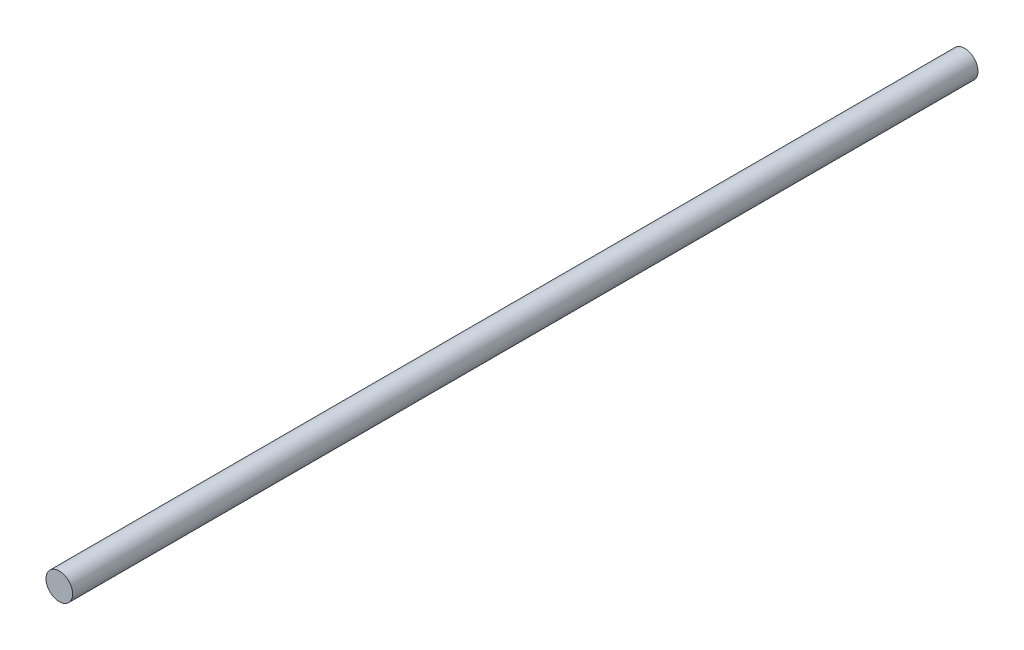
ISO-10303-21;
HEADER;
FILE_DESCRIPTION(('STEP AP214'),'2;1');
FILE_NAME('part.step','',(''),(''),'','','');
FILE_SCHEMA(('AUTOMOTIVE_DESIGN { 1 0 10303 214 1 1 1 1 }'));
ENDSEC;
DATA;
#1=APPLICATION_CONTEXT('core data for automotive mechanical design processes');
#2=APPLICATION_PROTOCOL_DEFINITION('international standard','automotive_design',2000,#1);
#3=PRODUCT_CONTEXT('',#1,'mechanical');
#4=PRODUCT('Part','Part','',(#3));
#5=PRODUCT_RELATED_PRODUCT_CATEGORY('part','',(#4));
#6=PRODUCT_DEFINITION_FORMATION('','',#4);
#7=PRODUCT_DEFINITION_CONTEXT('part definition',#1,'design');
#8=PRODUCT_DEFINITION('design','',#6,#7);
#9=PRODUCT_DEFINITION_SHAPE('','',#8);
#10=(LENGTH_UNIT() NAMED_UNIT(*) SI_UNIT(.MILLI.,.METRE.));
#11=(NAMED_UNIT(*) PLANE_ANGLE_UNIT() SI_UNIT($,.RADIAN.));
#12=(NAMED_UNIT(*) SI_UNIT($,.STERADIAN.) SOLID_ANGLE_UNIT());
#13=UNCERTAINTY_MEASURE_WITH_UNIT(LENGTH_MEASURE(1.E-05),#10,'distance_accuracy_value','');
#14=(GEOMETRIC_REPRESENTATION_CONTEXT(3) GLOBAL_UNCERTAINTY_ASSIGNED_CONTEXT((#13)) GLOBAL_UNIT_ASSIGNED_CONTEXT((#10,
#11,#12)) REPRESENTATION_CONTEXT('',''));
#15=CARTESIAN_POINT('',(0.,0.,0.));
#16=DIRECTION('',(0.,0.,1.));
#17=DIRECTION('',(1.,0.,0.));
#18=AXIS2_PLACEMENT_3D('',#15,#16,#17);
#19=CARTESIAN_POINT('',(0.,0.,340.));
#20=DIRECTION('',(0.,0.,-1.));
#21=DIRECTION('',(-1.,0.,0.));
#22=AXIS2_PLACEMENT_3D('',#19,#20,#21);
#23=CYLINDRICAL_SURFACE('',#22,5.);
#24=CARTESIAN_POINT('',(0.,0.,340.));
#25=DIRECTION('',(0.,0.,1.));
#26=DIRECTION('',(1.,0.,0.));
#27=AXIS2_PLACEMENT_3D('',#24,#25,#26);
#28=CIRCLE('',#27,5.);
#29=CARTESIAN_POINT('',(5.,0.,340.));
#30=VERTEX_POINT('',#29);
#31=EDGE_CURVE('E10',#30,#30,#28,.T.);
#32=ORIENTED_EDGE('',*,*,#31,.F.);
#33=EDGE_LOOP('',(#32));
#34=FACE_BOUND('',#33,.T.);
#35=CARTESIAN_POINT('',(0.,0.,0.));
#36=DIRECTION('',(0.,0.,1.));
#37=DIRECTION('',(1.,0.,0.));
#38=AXIS2_PLACEMENT_3D('',#35,#36,#37);
#39=CIRCLE('',#38,5.);
#40=CARTESIAN_POINT('',(5.,0.,0.));
#41=VERTEX_POINT('',#40);
#42=EDGE_CURVE('E38',#41,#41,#39,.T.);
#43=ORIENTED_EDGE('',*,*,#42,.T.);
#44=EDGE_LOOP('',(#43));
#45=FACE_BOUND('',#44,.T.);
#46=ADVANCED_FACE('F35',(#34,#45),#23,.T.);
#47=CARTESIAN_POINT('',(0.,0.,340.));
#48=DIRECTION('',(0.,0.,1.));
#49=DIRECTION('',(1.,0.,0.));
#50=AXIS2_PLACEMENT_3D('',#47,#48,#49);
#51=PLANE('',#50);
#52=ORIENTED_EDGE('',*,*,#31,.T.);
#53=EDGE_LOOP('',(#52));
#54=FACE_BOUND('',#53,.T.);
#55=ADVANCED_FACE('F50',(#54),#51,.T.);
#56=CARTESIAN_POINT('',(0.,0.,0.));
#57=DIRECTION('',(0.,0.,1.));
#58=DIRECTION('',(1.,0.,0.));
#59=AXIS2_PLACEMENT_3D('',#56,#57,#58);
#60=PLANE('',#59);
#61=ORIENTED_EDGE('',*,*,#42,.F.);
#62=EDGE_LOOP('',(#61));
#63=FACE_BOUND('',#62,.T.);
#64=ADVANCED_FACE('F48',(#63),#60,.F.);
#65=CLOSED_SHELL('',(#46,#55,#64));
#66=MANIFOLD_SOLID_BREP('B2',#65);
#67=ADVANCED_BREP_SHAPE_REPRESENTATION('',(#18,#66),#14);
#68=SHAPE_DEFINITION_REPRESENTATION(#9,#67);
ENDSEC;
END-ISO-10303-21;
